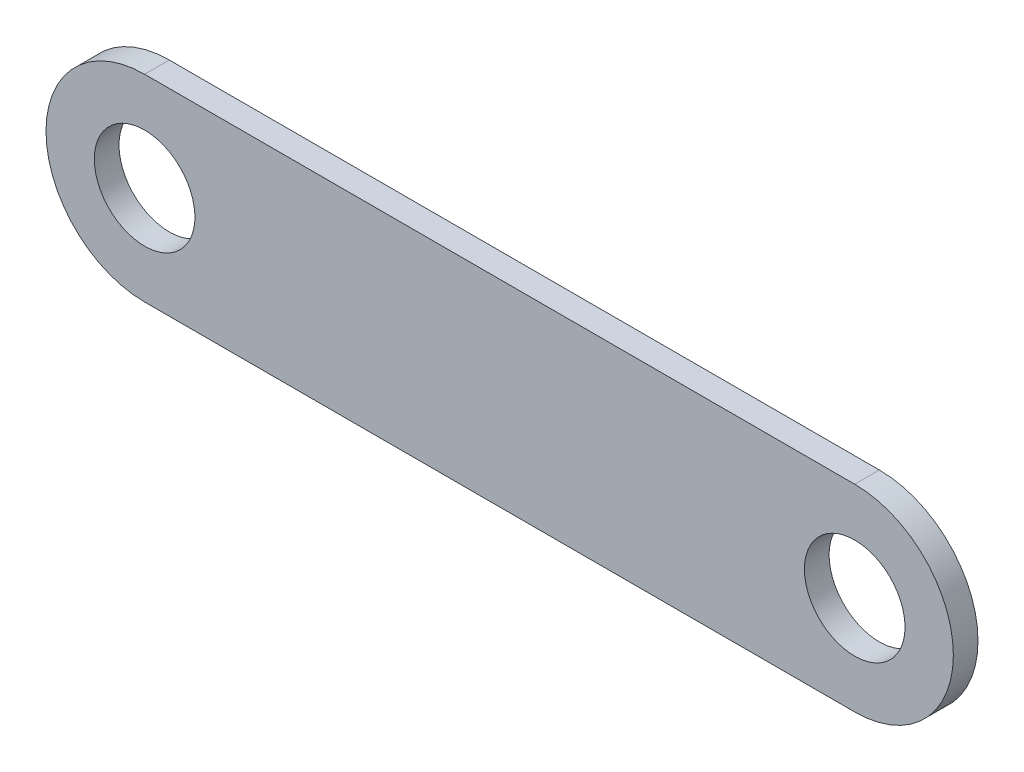
ISO-10303-21;
HEADER;
FILE_DESCRIPTION(('STEP AP214'),'2;1');
FILE_NAME('part.step','',(''),(''),'','','');
FILE_SCHEMA(('AUTOMOTIVE_DESIGN { 1 0 10303 214 1 1 1 1 }'));
ENDSEC;
DATA;
#1=APPLICATION_CONTEXT('core data for automotive mechanical design processes');
#2=APPLICATION_PROTOCOL_DEFINITION('international standard','automotive_design',2000,#1);
#3=PRODUCT_CONTEXT('',#1,'mechanical');
#4=PRODUCT('Part','Part','',(#3));
#5=PRODUCT_RELATED_PRODUCT_CATEGORY('part','',(#4));
#6=PRODUCT_DEFINITION_FORMATION('','',#4);
#7=PRODUCT_DEFINITION_CONTEXT('part definition',#1,'design');
#8=PRODUCT_DEFINITION('design','',#6,#7);
#9=PRODUCT_DEFINITION_SHAPE('','',#8);
#10=(LENGTH_UNIT() NAMED_UNIT(*) SI_UNIT(.MILLI.,.METRE.));
#11=(NAMED_UNIT(*) PLANE_ANGLE_UNIT() SI_UNIT($,.RADIAN.));
#12=(NAMED_UNIT(*) SI_UNIT($,.STERADIAN.) SOLID_ANGLE_UNIT());
#13=UNCERTAINTY_MEASURE_WITH_UNIT(LENGTH_MEASURE(1.E-05),#10,'distance_accuracy_value','');
#14=(GEOMETRIC_REPRESENTATION_CONTEXT(3) GLOBAL_UNCERTAINTY_ASSIGNED_CONTEXT((#13)) GLOBAL_UNIT_ASSIGNED_CONTEXT((#10,
#11,#12)) REPRESENTATION_CONTEXT('',''));
#15=CARTESIAN_POINT('',(0.,0.,0.));
#16=DIRECTION('',(0.,0.,1.));
#17=DIRECTION('',(1.,0.,0.));
#18=AXIS2_PLACEMENT_3D('',#15,#16,#17);
#19=CARTESIAN_POINT('',(-181.421038600226,-229.537331266431,0.));
#20=DIRECTION('',(0.,0.,1.));
#21=DIRECTION('',(1.,0.,0.));
#22=AXIS2_PLACEMENT_3D('',#19,#20,#21);
#23=PLANE('',#22);
#24=CARTESIAN_POINT('',(-203.021038600226,-229.537331266431,0.));
#25=DIRECTION('',(0.,0.,-1.));
#26=DIRECTION('',(1.,0.,0.));
#27=AXIS2_PLACEMENT_3D('',#24,#25,#26);
#28=CIRCLE('',#27,3.06);
#29=CARTESIAN_POINT('',(-206.081038600226,-229.537331266431,0.));
#30=VERTEX_POINT('',#29);
#31=EDGE_CURVE('E184',#30,#30,#28,.T.);
#32=ORIENTED_EDGE('',*,*,#31,.F.);
#33=EDGE_LOOP('',(#32));
#34=FACE_BOUND('',#33,.T.);
#35=CARTESIAN_POINT('',(-159.821038600226,-229.537331266431,0.));
#36=DIRECTION('',(0.,0.,-1.));
#37=DIRECTION('',(1.,0.,0.));
#38=AXIS2_PLACEMENT_3D('',#35,#36,#37);
#39=CIRCLE('',#38,3.06);
#40=CARTESIAN_POINT('',(-162.881038600226,-229.537331266431,0.));
#41=VERTEX_POINT('',#40);
#42=EDGE_CURVE('E131',#41,#41,#39,.T.);
#43=ORIENTED_EDGE('',*,*,#42,.F.);
#44=EDGE_LOOP('',(#43));
#45=FACE_BOUND('',#44,.T.);
#46=DIRECTION('',(1.,0.,0.));
#47=VECTOR('',#46,1.);
#48=CARTESIAN_POINT('',(-203.021038600226,-235.537331266431,0.));
#49=LINE('',#48,#47);
#50=CARTESIAN_POINT('',(-203.021038600226,-235.537331266431,0.));
#51=VERTEX_POINT('',#50);
#52=CARTESIAN_POINT('',(-159.821038600226,-235.537331266431,0.));
#53=VERTEX_POINT('',#52);
#54=EDGE_CURVE('E27',#51,#53,#49,.T.);
#55=ORIENTED_EDGE('',*,*,#54,.F.);
#56=CARTESIAN_POINT('',(-203.021038600226,-229.537331266431,0.));
#57=DIRECTION('',(0.,0.,1.));
#58=DIRECTION('',(0.,1.,0.));
#59=AXIS2_PLACEMENT_3D('',#56,#57,#58);
#60=CIRCLE('',#59,6.00000000000023);
#61=CARTESIAN_POINT('',(-203.021038600226,-223.537331266431,0.));
#62=VERTEX_POINT('',#61);
#63=EDGE_CURVE('E129',#62,#51,#60,.T.);
#64=ORIENTED_EDGE('',*,*,#63,.F.);
#65=DIRECTION('',(1.,0.,0.));
#66=VECTOR('',#65,1.);
#67=CARTESIAN_POINT('',(-203.021038600226,-223.537331266431,0.));
#68=LINE('',#67,#66);
#69=CARTESIAN_POINT('',(-159.821038600226,-223.537331266431,0.));
#70=VERTEX_POINT('',#69);
#71=EDGE_CURVE('E104',#62,#70,#68,.T.);
#72=ORIENTED_EDGE('',*,*,#71,.T.);
#73=CARTESIAN_POINT('',(-159.821038600226,-229.537331266431,0.));
#74=DIRECTION('',(0.,0.,1.));
#75=DIRECTION('',(0.,-1.,0.));
#76=AXIS2_PLACEMENT_3D('',#73,#74,#75);
#77=CIRCLE('',#76,6.00000000000023);
#78=EDGE_CURVE('E89',#53,#70,#77,.T.);
#79=ORIENTED_EDGE('',*,*,#78,.F.);
#80=EDGE_LOOP('',(#55,#64,#72,#79));
#81=FACE_BOUND('',#80,.T.);
#82=ADVANCED_FACE('F17',(#34,#45,#81),#23,.F.);
#83=CARTESIAN_POINT('',(-181.421038600226,-229.537331266431,1.5));
#84=DIRECTION('',(0.,0.,1.));
#85=DIRECTION('',(1.,0.,0.));
#86=AXIS2_PLACEMENT_3D('',#83,#84,#85);
#87=PLANE('',#86);
#88=CARTESIAN_POINT('',(-203.021038600226,-229.537331266431,1.5));
#89=DIRECTION('',(0.,0.,-1.));
#90=DIRECTION('',(1.,0.,0.));
#91=AXIS2_PLACEMENT_3D('',#88,#89,#90);
#92=CIRCLE('',#91,3.06);
#93=CARTESIAN_POINT('',(-206.081038600226,-229.537331266431,1.5));
#94=VERTEX_POINT('',#93);
#95=EDGE_CURVE('E135',#94,#94,#92,.T.);
#96=ORIENTED_EDGE('',*,*,#95,.T.);
#97=EDGE_LOOP('',(#96));
#98=FACE_BOUND('',#97,.T.);
#99=CARTESIAN_POINT('',(-159.821038600226,-229.537331266431,1.5));
#100=DIRECTION('',(0.,0.,-1.));
#101=DIRECTION('',(1.,0.,0.));
#102=AXIS2_PLACEMENT_3D('',#99,#100,#101);
#103=CIRCLE('',#102,3.06);
#104=CARTESIAN_POINT('',(-162.881038600226,-229.537331266431,1.5));
#105=VERTEX_POINT('',#104);
#106=EDGE_CURVE('E126',#105,#105,#103,.T.);
#107=ORIENTED_EDGE('',*,*,#106,.T.);
#108=EDGE_LOOP('',(#107));
#109=FACE_BOUND('',#108,.T.);
#110=DIRECTION('',(1.,0.,0.));
#111=VECTOR('',#110,1.);
#112=CARTESIAN_POINT('',(-203.021038600226,-235.537331266431,1.5));
#113=LINE('',#112,#111);
#114=CARTESIAN_POINT('',(-203.021038600226,-235.537331266431,1.5));
#115=VERTEX_POINT('',#114);
#116=CARTESIAN_POINT('',(-159.821038600226,-235.537331266431,1.5));
#117=VERTEX_POINT('',#116);
#118=EDGE_CURVE('E11',#115,#117,#113,.T.);
#119=ORIENTED_EDGE('',*,*,#118,.T.);
#120=CARTESIAN_POINT('',(-159.821038600226,-229.537331266431,1.5));
#121=DIRECTION('',(0.,0.,1.));
#122=DIRECTION('',(0.,-1.,0.));
#123=AXIS2_PLACEMENT_3D('',#120,#121,#122);
#124=CIRCLE('',#123,6.00000000000023);
#125=CARTESIAN_POINT('',(-159.821038600226,-223.537331266431,1.5));
#126=VERTEX_POINT('',#125);
#127=EDGE_CURVE('E79',#117,#126,#124,.T.);
#128=ORIENTED_EDGE('',*,*,#127,.T.);
#129=DIRECTION('',(-1.,0.,0.));
#130=VECTOR('',#129,1.);
#131=CARTESIAN_POINT('',(-203.021038600226,-223.537331266431,1.5));
#132=LINE('',#131,#130);
#133=CARTESIAN_POINT('',(-203.021038600226,-223.537331266431,1.5));
#134=VERTEX_POINT('',#133);
#135=EDGE_CURVE('E83',#126,#134,#132,.T.);
#136=ORIENTED_EDGE('',*,*,#135,.T.);
#137=CARTESIAN_POINT('',(-203.021038600226,-229.537331266431,1.5));
#138=DIRECTION('',(0.,0.,1.));
#139=DIRECTION('',(0.,1.,0.));
#140=AXIS2_PLACEMENT_3D('',#137,#138,#139);
#141=CIRCLE('',#140,6.00000000000023);
#142=EDGE_CURVE('E139',#134,#115,#141,.T.);
#143=ORIENTED_EDGE('',*,*,#142,.T.);
#144=EDGE_LOOP('',(#119,#128,#136,#143));
#145=FACE_BOUND('',#144,.T.);
#146=ADVANCED_FACE('F81',(#98,#109,#145),#87,.T.);
#147=CARTESIAN_POINT('',(-203.021038600226,-235.537331266431,0.));
#148=DIRECTION('',(0.,-1.,0.));
#149=DIRECTION('',(0.,0.,-1.));
#150=AXIS2_PLACEMENT_3D('',#147,#148,#149);
#151=PLANE('',#150);
#152=ORIENTED_EDGE('',*,*,#54,.T.);
#153=DIRECTION('',(0.,0.,1.));
#154=VECTOR('',#153,1.);
#155=CARTESIAN_POINT('',(-159.821038600226,-235.537331266431,0.));
#156=LINE('',#155,#154);
#157=EDGE_CURVE('E88',#53,#117,#156,.T.);
#158=ORIENTED_EDGE('',*,*,#157,.T.);
#159=ORIENTED_EDGE('',*,*,#118,.F.);
#160=DIRECTION('',(0.,0.,1.));
#161=VECTOR('',#160,1.);
#162=CARTESIAN_POINT('',(-203.021038600226,-235.537331266431,0.));
#163=LINE('',#162,#161);
#164=EDGE_CURVE('E142',#51,#115,#163,.T.);
#165=ORIENTED_EDGE('',*,*,#164,.F.);
#166=EDGE_LOOP('',(#152,#158,#159,#165));
#167=FACE_BOUND('',#166,.T.);
#168=ADVANCED_FACE('F19',(#167),#151,.T.);
#169=CARTESIAN_POINT('',(-159.821038600226,-229.537331266431,0.));
#170=DIRECTION('',(0.,0.,1.));
#171=DIRECTION('',(0.,-1.,0.));
#172=AXIS2_PLACEMENT_3D('',#169,#170,#171);
#173=CYLINDRICAL_SURFACE('',#172,6.00000000000023);
#174=ORIENTED_EDGE('',*,*,#78,.T.);
#175=DIRECTION('',(0.,0.,1.));
#176=VECTOR('',#175,1.);
#177=CARTESIAN_POINT('',(-159.821038600226,-223.537331266431,0.));
#178=LINE('',#177,#176);
#179=EDGE_CURVE('E92',#70,#126,#178,.T.);
#180=ORIENTED_EDGE('',*,*,#179,.T.);
#181=ORIENTED_EDGE('',*,*,#127,.F.);
#182=ORIENTED_EDGE('',*,*,#157,.F.);
#183=EDGE_LOOP('',(#174,#180,#181,#182));
#184=FACE_BOUND('',#183,.T.);
#185=ADVANCED_FACE('F93',(#184),#173,.T.);
#186=CARTESIAN_POINT('',(-159.821038600226,-223.537331266431,0.));
#187=DIRECTION('',(0.,1.,0.));
#188=DIRECTION('',(1.,0.,0.));
#189=AXIS2_PLACEMENT_3D('',#186,#187,#188);
#190=PLANE('',#189);
#191=ORIENTED_EDGE('',*,*,#71,.F.);
#192=DIRECTION('',(0.,0.,1.));
#193=VECTOR('',#192,1.);
#194=CARTESIAN_POINT('',(-203.021038600226,-223.537331266431,0.));
#195=LINE('',#194,#193);
#196=EDGE_CURVE('E101',#62,#134,#195,.T.);
#197=ORIENTED_EDGE('',*,*,#196,.T.);
#198=ORIENTED_EDGE('',*,*,#135,.F.);
#199=ORIENTED_EDGE('',*,*,#179,.F.);
#200=EDGE_LOOP('',(#191,#197,#198,#199));
#201=FACE_BOUND('',#200,.T.);
#202=ADVANCED_FACE('F99',(#201),#190,.T.);
#203=CARTESIAN_POINT('',(-203.021038600226,-229.537331266431,0.));
#204=DIRECTION('',(0.,0.,1.));
#205=DIRECTION('',(0.,1.,0.));
#206=AXIS2_PLACEMENT_3D('',#203,#204,#205);
#207=CYLINDRICAL_SURFACE('',#206,6.00000000000023);
#208=ORIENTED_EDGE('',*,*,#63,.T.);
#209=ORIENTED_EDGE('',*,*,#164,.T.);
#210=ORIENTED_EDGE('',*,*,#142,.F.);
#211=ORIENTED_EDGE('',*,*,#196,.F.);
#212=EDGE_LOOP('',(#208,#209,#210,#211));
#213=FACE_BOUND('',#212,.T.);
#214=ADVANCED_FACE('F204',(#213),#207,.T.);
#215=CARTESIAN_POINT('',(-159.821038600226,-229.537331266431,0.));
#216=DIRECTION('',(0.,0.,1.));
#217=DIRECTION('',(1.,0.,0.));
#218=AXIS2_PLACEMENT_3D('',#215,#216,#217);
#219=CYLINDRICAL_SURFACE('',#218,3.06);
#220=ORIENTED_EDGE('',*,*,#42,.T.);
#221=DIRECTION('',(0.,0.,1.));
#222=VECTOR('',#221,1.);
#223=CARTESIAN_POINT('',(-162.881038600226,-229.537331266431,0.));
#224=LINE('',#223,#222);
#225=EDGE_CURVE('E130',#41,#105,#224,.T.);
#226=ORIENTED_EDGE('',*,*,#225,.T.);
#227=ORIENTED_EDGE('',*,*,#106,.F.);
#228=ORIENTED_EDGE('',*,*,#225,.F.);
#229=EDGE_LOOP('',(#220,#226,#227,#228));
#230=FACE_BOUND('',#229,.T.);
#231=ADVANCED_FACE('F206',(#230),#219,.F.);
#232=CARTESIAN_POINT('',(-203.021038600226,-229.537331266431,0.));
#233=DIRECTION('',(0.,0.,1.));
#234=DIRECTION('',(1.,0.,0.));
#235=AXIS2_PLACEMENT_3D('',#232,#233,#234);
#236=CYLINDRICAL_SURFACE('',#235,3.06);
#237=ORIENTED_EDGE('',*,*,#31,.T.);
#238=DIRECTION('',(0.,0.,1.));
#239=VECTOR('',#238,1.);
#240=CARTESIAN_POINT('',(-206.081038600226,-229.537331266431,0.));
#241=LINE('',#240,#239);
#242=EDGE_CURVE('E124',#30,#94,#241,.T.);
#243=ORIENTED_EDGE('',*,*,#242,.T.);
#244=ORIENTED_EDGE('',*,*,#95,.F.);
#245=ORIENTED_EDGE('',*,*,#242,.F.);
#246=EDGE_LOOP('',(#237,#243,#244,#245));
#247=FACE_BOUND('',#246,.T.);
#248=ADVANCED_FACE('F194',(#247),#236,.F.);
#249=CLOSED_SHELL('',(#82,#146,#168,#185,#202,#214,#231,#248));
#250=MANIFOLD_SOLID_BREP('B1',#249);
#251=ADVANCED_BREP_SHAPE_REPRESENTATION('',(#18,#250),#14);
#252=SHAPE_DEFINITION_REPRESENTATION(#9,#251);
ENDSEC;
END-ISO-10303-21;
